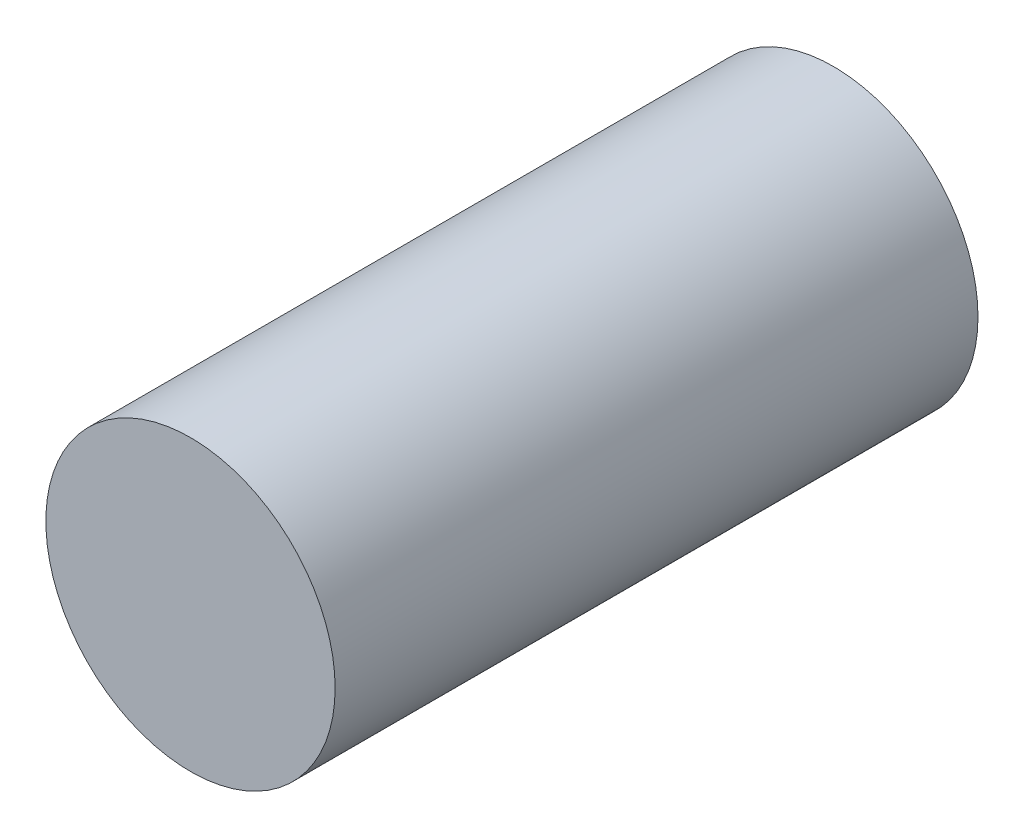
ISO-10303-21;
HEADER;
FILE_DESCRIPTION(('STEP AP214'),'2;1');
FILE_NAME('part.step','',(''),(''),'','','');
FILE_SCHEMA(('AUTOMOTIVE_DESIGN { 1 0 10303 214 1 1 1 1 }'));
ENDSEC;
DATA;
#1=APPLICATION_CONTEXT('core data for automotive mechanical design processes');
#2=APPLICATION_PROTOCOL_DEFINITION('international standard','automotive_design',2000,#1);
#3=PRODUCT_CONTEXT('',#1,'mechanical');
#4=PRODUCT('Part','Part','',(#3));
#5=PRODUCT_RELATED_PRODUCT_CATEGORY('part','',(#4));
#6=PRODUCT_DEFINITION_FORMATION('','',#4);
#7=PRODUCT_DEFINITION_CONTEXT('part definition',#1,'design');
#8=PRODUCT_DEFINITION('design','',#6,#7);
#9=PRODUCT_DEFINITION_SHAPE('','',#8);
#10=(LENGTH_UNIT() NAMED_UNIT(*) SI_UNIT(.MILLI.,.METRE.));
#11=(NAMED_UNIT(*) PLANE_ANGLE_UNIT() SI_UNIT($,.RADIAN.));
#12=(NAMED_UNIT(*) SI_UNIT($,.STERADIAN.) SOLID_ANGLE_UNIT());
#13=UNCERTAINTY_MEASURE_WITH_UNIT(LENGTH_MEASURE(1.E-05),#10,'distance_accuracy_value','');
#14=(GEOMETRIC_REPRESENTATION_CONTEXT(3) GLOBAL_UNCERTAINTY_ASSIGNED_CONTEXT((#13)) GLOBAL_UNIT_ASSIGNED_CONTEXT((#10,
#11,#12)) REPRESENTATION_CONTEXT('',''));
#15=CARTESIAN_POINT('',(0.,0.,0.));
#16=DIRECTION('',(0.,0.,1.));
#17=DIRECTION('',(1.,0.,0.));
#18=AXIS2_PLACEMENT_3D('',#15,#16,#17);
#19=CARTESIAN_POINT('',(0.,0.,20.));
#20=DIRECTION('',(0.,0.,-1.));
#21=DIRECTION('',(-1.,0.,0.));
#22=AXIS2_PLACEMENT_3D('',#19,#20,#21);
#23=CYLINDRICAL_SURFACE('',#22,4.5);
#24=CARTESIAN_POINT('',(0.,0.,20.));
#25=DIRECTION('',(0.,0.,1.));
#26=DIRECTION('',(1.,0.,0.));
#27=AXIS2_PLACEMENT_3D('',#24,#25,#26);
#28=CIRCLE('',#27,4.5);
#29=CARTESIAN_POINT('',(4.5,0.,20.));
#30=VERTEX_POINT('',#29);
#31=EDGE_CURVE('E10',#30,#30,#28,.T.);
#32=ORIENTED_EDGE('',*,*,#31,.F.);
#33=EDGE_LOOP('',(#32));
#34=FACE_BOUND('',#33,.T.);
#35=CARTESIAN_POINT('',(0.,0.,0.));
#36=DIRECTION('',(0.,0.,1.));
#37=DIRECTION('',(1.,0.,0.));
#38=AXIS2_PLACEMENT_3D('',#35,#36,#37);
#39=CIRCLE('',#38,4.5);
#40=CARTESIAN_POINT('',(4.5,0.,0.));
#41=VERTEX_POINT('',#40);
#42=EDGE_CURVE('E40',#41,#41,#39,.T.);
#43=ORIENTED_EDGE('',*,*,#42,.T.);
#44=EDGE_LOOP('',(#43));
#45=FACE_BOUND('',#44,.T.);
#46=ADVANCED_FACE('F37',(#34,#45),#23,.T.);
#47=CARTESIAN_POINT('',(0.,0.,20.));
#48=DIRECTION('',(0.,0.,1.));
#49=DIRECTION('',(1.,0.,0.));
#50=AXIS2_PLACEMENT_3D('',#47,#48,#49);
#51=PLANE('',#50);
#52=ORIENTED_EDGE('',*,*,#31,.T.);
#53=EDGE_LOOP('',(#52));
#54=FACE_BOUND('',#53,.T.);
#55=ADVANCED_FACE('F54',(#54),#51,.T.);
#56=CARTESIAN_POINT('',(0.,0.,0.));
#57=DIRECTION('',(0.,0.,1.));
#58=DIRECTION('',(1.,0.,0.));
#59=AXIS2_PLACEMENT_3D('',#56,#57,#58);
#60=PLANE('',#59);
#61=ORIENTED_EDGE('',*,*,#42,.F.);
#62=EDGE_LOOP('',(#61));
#63=FACE_BOUND('',#62,.T.);
#64=ADVANCED_FACE('F52',(#63),#60,.F.);
#65=CLOSED_SHELL('',(#46,#55,#64));
#66=MANIFOLD_SOLID_BREP('B2',#65);
#67=ADVANCED_BREP_SHAPE_REPRESENTATION('',(#18,#66),#14);
#68=SHAPE_DEFINITION_REPRESENTATION(#9,#67);
ENDSEC;
END-ISO-10303-21;
